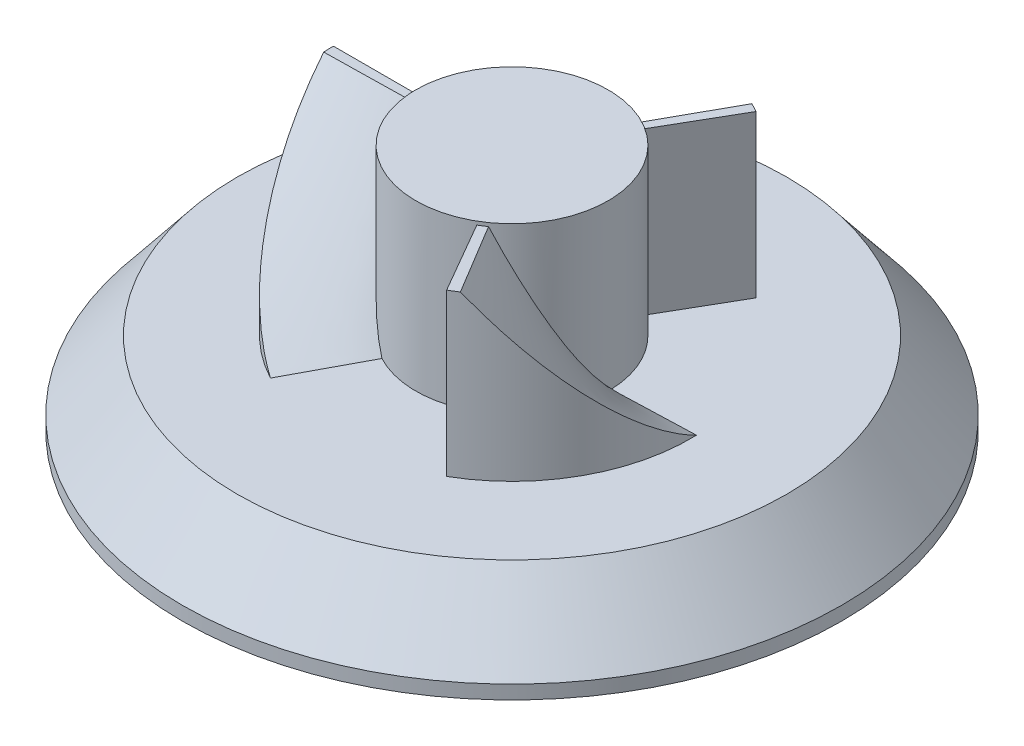
ISO-10303-21;
HEADER;
FILE_DESCRIPTION(('STEP AP214'),'2;1');
FILE_NAME('part.step','',(''),(''),'','','');
FILE_SCHEMA(('AUTOMOTIVE_DESIGN { 1 0 10303 214 1 1 1 1 }'));
ENDSEC;
DATA;
#1=APPLICATION_CONTEXT('core data for automotive mechanical design processes');
#2=APPLICATION_PROTOCOL_DEFINITION('international standard','automotive_design',2000,#1);
#3=PRODUCT_CONTEXT('',#1,'mechanical');
#4=PRODUCT('Part','Part','',(#3));
#5=PRODUCT_RELATED_PRODUCT_CATEGORY('part','',(#4));
#6=PRODUCT_DEFINITION_FORMATION('','',#4);
#7=PRODUCT_DEFINITION_CONTEXT('part definition',#1,'design');
#8=PRODUCT_DEFINITION('design','',#6,#7);
#9=PRODUCT_DEFINITION_SHAPE('','',#8);
#10=(LENGTH_UNIT() NAMED_UNIT(*) SI_UNIT(.MILLI.,.METRE.));
#11=(NAMED_UNIT(*) PLANE_ANGLE_UNIT() SI_UNIT($,.RADIAN.));
#12=(NAMED_UNIT(*) SI_UNIT($,.STERADIAN.) SOLID_ANGLE_UNIT());
#13=UNCERTAINTY_MEASURE_WITH_UNIT(LENGTH_MEASURE(1.E-05),#10,'distance_accuracy_value','');
#14=(GEOMETRIC_REPRESENTATION_CONTEXT(3) GLOBAL_UNCERTAINTY_ASSIGNED_CONTEXT((#13)) GLOBAL_UNIT_ASSIGNED_CONTEXT((#10,
#11,#12)) REPRESENTATION_CONTEXT('',''));
#15=CARTESIAN_POINT('',(0.,0.,0.));
#16=DIRECTION('',(0.,0.,1.));
#17=DIRECTION('',(1.,0.,0.));
#18=AXIS2_PLACEMENT_3D('',#15,#16,#17);
#19=CARTESIAN_POINT('',(0.,14.0890625,0.));
#20=DIRECTION('',(0.,1.,0.));
#21=DIRECTION('',(0.866025403784443,0.,-0.499999999999992));
#22=AXIS2_PLACEMENT_3D('',#19,#20,#21);
#23=PLANE('',#22);
#24=CARTESIAN_POINT('',(0.,14.0890625,0.));
#25=DIRECTION('',(0.,1.,0.));
#26=DIRECTION('',(0.866025403784443,0.,-0.499999999999992));
#27=AXIS2_PLACEMENT_3D('',#24,#25,#26);
#28=CIRCLE('',#27,5.55625);
#29=CARTESIAN_POINT('',(2.77812499999995,14.0890625,4.81185364977731));
#30=VERTEX_POINT('',#29);
#31=CARTESIAN_POINT('',(3.19237647885135,14.0890625,4.54759788017549));
#32=VERTEX_POINT('',#31);
#33=EDGE_CURVE('E227',#30,#32,#28,.T.);
#34=ORIENTED_EDGE('',*,*,#33,.F.);
#35=DIRECTION('',(0.499999999999992,0.,0.866025403784443));
#36=VECTOR('',#35,1.);
#37=CARTESIAN_POINT('',(2.77812499999995,14.0890625,4.81185364977731));
#38=LINE('',#37,#36);
#39=CARTESIAN_POINT('',(5.15854949999992,14.0890625,8.93486982735908));
#40=VERTEX_POINT('',#39);
#41=EDGE_CURVE('E278',#30,#40,#38,.T.);
#42=ORIENTED_EDGE('',*,*,#41,.T.);
#43=CARTESIAN_POINT('',(-2.34994393743815E-13,14.0890625,-1.27278935977364E-13));
#44=DIRECTION('',(0.,1.,0.));
#45=DIRECTION('',(0.866025403784443,0.,-0.499999999999992));
#46=AXIS2_PLACEMENT_3D('',#43,#44,#45);
#47=CIRCLE('',#46,10.3170990000002);
#48=CARTESIAN_POINT('',(5.65134444194319,14.0890625,8.63161849100843));
#49=VERTEX_POINT('',#48);
#50=EDGE_CURVE('E658',#40,#49,#47,.T.);
#51=ORIENTED_EDGE('',*,*,#50,.T.);
#52=CARTESIAN_POINT('',(3.19236971065958,14.0890625032246,4.54760566581315));
#53=CARTESIAN_POINT('',(3.4105975646822,14.0890625013261,4.91011699002403));
#54=CARTESIAN_POINT('',(3.62883286887451,14.0890625003943,5.27262382929751));
#55=CARTESIAN_POINT('',(4.06531842637323,14.0890624996057,5.99762850780289));
#56=CARTESIAN_POINT('',(4.28356867967964,14.0890624997488,6.36012634703478));
#57=CARTESIAN_POINT('',(4.88497393711525,14.089062500441,7.35897009332785));
#58=CARTESIAN_POINT('',(5.26814455191824,14.0890625012152,7.99530660122229));
#59=CARTESIAN_POINT('',(5.6513384082714,14.0890625,8.63162911324434));
#60=B_SPLINE_CURVE_WITH_KNOTS('',3,(#52,#53,#54,#55,#56,#57,#58,#59),.UNSPECIFIED.,.F.,.F.,(4,2,
2,4),(0.,1.26938595697646,2.53877191395458,4.76715582022197),.UNSPECIFIED.);
#61=EDGE_CURVE('E645',#32,#49,#60,.T.);
#62=ORIENTED_EDGE('',*,*,#61,.F.);
#63=EDGE_LOOP('',(#34,#42,#51,#62));
#64=FACE_BOUND('',#63,.T.);
#65=ADVANCED_FACE('F253',(#64),#23,.T.);
#66=CARTESIAN_POINT('',(2.77812499999995,20.0245471377706,4.81185364977731));
#67=DIRECTION('',(0.866025403784443,0.,-0.499999999999992));
#68=DIRECTION('',(0.,-1.,0.));
#69=AXIS2_PLACEMENT_3D('',#66,#67,#68);
#70=PLANE('',#69);
#71=ORIENTED_EDGE('',*,*,#41,.F.);
#72=DIRECTION('',(0.,-1.,0.));
#73=VECTOR('',#72,1.);
#74=CARTESIAN_POINT('',(2.77812499999995,20.0245471377706,4.81185364977731));
#75=LINE('',#74,#73);
#76=CARTESIAN_POINT('',(2.77812499999995,4.7625,4.81185364977731));
#77=VERTEX_POINT('',#76);
#78=EDGE_CURVE('E673',#30,#77,#75,.T.);
#79=ORIENTED_EDGE('',*,*,#78,.T.);
#80=DIRECTION('',(0.499999999999992,0.,0.866025403784443));
#81=VECTOR('',#80,1.);
#82=CARTESIAN_POINT('',(2.77812499999995,4.7625,4.81185364977731));
#83=LINE('',#82,#81);
#84=CARTESIAN_POINT('',(5.15854949999992,4.7625,8.93486982735908));
#85=VERTEX_POINT('',#84);
#86=EDGE_CURVE('E263',#77,#85,#83,.T.);
#87=ORIENTED_EDGE('',*,*,#86,.T.);
#88=DIRECTION('',(0.,-1.,0.));
#89=VECTOR('',#88,1.);
#90=CARTESIAN_POINT('',(5.15854949999992,20.0245471377706,8.93486982735908));
#91=LINE('',#90,#89);
#92=EDGE_CURVE('E662',#40,#85,#91,.T.);
#93=ORIENTED_EDGE('',*,*,#92,.F.);
#94=EDGE_LOOP('',(#71,#79,#87,#93));
#95=FACE_BOUND('',#94,.T.);
#96=ADVANCED_FACE('F680',(#95),#70,.F.);
#97=CARTESIAN_POINT('',(-2.34994393743815E-13,20.0245471377706,-1.27088173132668E-13));
#98=DIRECTION('',(0.,-1.,0.));
#99=DIRECTION('',(-0.866025403784443,0.,0.499999999999992));
#100=AXIS2_PLACEMENT_3D('',#97,#98,#99);
#101=CYLINDRICAL_SURFACE('',#100,10.3170990000002);
#102=ORIENTED_EDGE('',*,*,#50,.F.);
#103=ORIENTED_EDGE('',*,*,#92,.T.);
#104=CARTESIAN_POINT('',(-2.34994393743815E-13,4.7625,-1.27578685989757E-13));
#105=DIRECTION('',(0.,1.,0.));
#106=DIRECTION('',(0.866025403784443,0.,-0.499999999999992));
#107=AXIS2_PLACEMENT_3D('',#104,#105,#106);
#108=CIRCLE('',#107,10.3170990000002);
#109=CARTESIAN_POINT('',(10.3112463050324,4.7625,-0.347464261120108));
#110=VERTEX_POINT('',#109);
#111=EDGE_CURVE('E666',#85,#110,#108,.T.);
#112=ORIENTED_EDGE('',*,*,#111,.T.);
#113=CARTESIAN_POINT('',(9.83170040013376,7.11756354775058,3.12733097349962));
#114=CARTESIAN_POINT('',(9.87538355132948,7.00103311729126,2.98998937129289));
#115=CARTESIAN_POINT('',(9.91652989565909,6.88583607115862,2.850689371109));
#116=CARTESIAN_POINT('',(9.99290161094393,6.65997794130164,2.57012017939754));
#117=CARTESIAN_POINT('',(10.0281995503523,6.54927657704112,2.42890311944083));
#118=CARTESIAN_POINT('',(10.0927841735259,6.33258975089081,2.14467117336124));
#119=CARTESIAN_POINT('',(10.1221459529281,6.22656067156618,2.00170671358596));
#120=CARTESIAN_POINT('',(10.1747616512615,6.01940752613842,1.71415722551683));
#121=CARTESIAN_POINT('',(10.1980927343348,5.91823654341795,1.56962019124599));
#122=CARTESIAN_POINT('',(10.2385526859972,5.72098594937692,1.27910177444507));
#123=CARTESIAN_POINT('',(10.2557600213007,5.62485647413353,1.13316526779103));
#124=CARTESIAN_POINT('',(10.2838784672141,5.437876056161,0.840026291693822));
#125=CARTESIAN_POINT('',(10.294868383655,5.34697280356044,0.692864824551129));
#126=CARTESIAN_POINT('',(10.3104587606913,5.17062932645605,0.397450889411813));
#127=CARTESIAN_POINT('',(10.3151371464827,5.08513513567946,0.249234876951194));
#128=CARTESIAN_POINT('',(10.3180135099169,4.91980056761641,-0.0480976014691051));
#129=CARTESIAN_POINT('',(10.3162870243019,4.83990553990756,-0.197182997972606));
#130=CARTESIAN_POINT('',(10.3112463050324,4.7625,-0.347464261120093));
#131=B_SPLINE_CURVE_WITH_KNOTS('',3,(#113,#114,#115,#116,#117,#118,#119,#120,#121,#122,#123,
#124,#125,#126,#127,#128,#129,#130),.UNSPECIFIED.,.F.,.F.,(4,2,2,2,2,2,2,2,4),(0.,
0.556004175834258,1.10448677511103,1.64552398709619,2.179251169221,2.70586980590569,
3.22565473923862,3.73896155624869,4.24623396783489),.UNSPECIFIED.);
#132=CARTESIAN_POINT('',(9.83170040013376,7.11756354775058,3.12733097349962));
#133=VERTEX_POINT('',#132);
#134=EDGE_CURVE('E619',#133,#110,#131,.T.);
#135=ORIENTED_EDGE('',*,*,#134,.F.);
#136=CARTESIAN_POINT('',(5.49854274300475,14.2875,8.72975139847355));
#137=CARTESIAN_POINT('',(8.60195770803907,10.2779686259833,6.77502679571962));
#138=CARTESIAN_POINT('',(10.4347693858802,6.65058310214233,3.31817003137396));
#139=CARTESIAN_POINT('',(10.3112463050324,4.7625,-0.347464261120093));
#140=B_SPLINE_CURVE_WITH_KNOTS('',3,(#136,#137,#138,#139),.UNSPECIFIED.,.F.,.F.,(4,4),(0.,1.),.UNSPECIFIED.);
#141=CARTESIAN_POINT('',(8.10558590323824,10.5337807261086,6.38294672866896));
#142=VERTEX_POINT('',#141);
#143=EDGE_CURVE('E630',#142,#133,#140,.T.);
#144=ORIENTED_EDGE('',*,*,#143,.F.);
#145=CARTESIAN_POINT('',(5.65134165445893,14.0890571197496,8.63162496247652));
#146=CARTESIAN_POINT('',(5.76766440054171,13.937192485245,8.55547145583613));
#147=CARTESIAN_POINT('',(5.88252291926056,13.7854055608572,8.47692464235881));
#148=CARTESIAN_POINT('',(6.10841127546717,13.4831607541603,8.31563141745894));
#149=CARTESIAN_POINT('',(6.21946222314373,13.3327009838614,8.23291810311871));
#150=CARTESIAN_POINT('',(6.43766080562355,13.0332602154464,8.06343699137192));
#151=CARTESIAN_POINT('',(6.5448310155968,12.8842764399458,7.97670319692709));
#152=CARTESIAN_POINT('',(6.73254760596127,12.6198264550236,7.81840302452953));
#153=CARTESIAN_POINT('',(6.81372257207801,12.5042620613102,7.7477442107826));
#154=CARTESIAN_POINT('',(6.96817560980569,12.2820240192265,7.60899708759228));
#155=CARTESIAN_POINT('',(7.04159367863583,12.1753250047131,7.54110521801016));
#156=CARTESIAN_POINT('',(7.20464239728649,11.9359261981967,7.38586500474082));
#157=CARTESIAN_POINT('',(7.29379064182533,11.8033241361146,7.29785837092724));
#158=CARTESIAN_POINT('',(7.49559231261047,11.4990951757743,7.09120958155127));
#159=CARTESIAN_POINT('',(7.60727831649618,11.3276891110837,6.97129413961867));
#160=CARTESIAN_POINT('',(7.84997635978209,10.9481709879264,6.69782371989578));
#161=CARTESIAN_POINT('',(7.97975519622295,10.7403828468296,6.54272316624375));
#162=CARTESIAN_POINT('',(8.10558590323824,10.5337807261086,6.38294672866896));
#163=B_SPLINE_CURVE_WITH_KNOTS('',3,(#145,#146,#147,#148,#149,#150,#151,#152,#153,#154,#155,
#156,#157,#158,#159,#160,#161,#162),.UNSPECIFIED.,.F.,.F.,(4,2,2,2,2,2,2,2,4),(0.,
0.617669745154775,1.23103316446487,1.83991932888812,2.31362905191251,2.75230050628312,
3.29949307798517,4.01076372458203,4.88038783259177),.UNSPECIFIED.);
#164=EDGE_CURVE('E640',#49,#142,#163,.T.);
#165=ORIENTED_EDGE('',*,*,#164,.F.);
#166=EDGE_LOOP('',(#102,#103,#112,#135,#144,#165));
#167=FACE_BOUND('',#166,.T.);
#168=ADVANCED_FACE('F581',(#167),#101,.T.);
#169=CARTESIAN_POINT('',(5.49854274300475,14.2875,8.72975139847355));
#170=CARTESIAN_POINT('',(4.70397454632911,14.2875,7.35351891175294));
#171=CARTESIAN_POINT('',(3.90940634965347,14.2875,5.97728642503232));
#172=CARTESIAN_POINT('',(3.11483815297783,14.2875,4.6010539383117));
#173=CARTESIAN_POINT('',(8.60195770803907,10.2779686259833,6.77502679571962));
#174=CARTESIAN_POINT('',(7.30011400280976,10.2720560523493,5.69346602067495));
#175=CARTESIAN_POINT('',(5.99827029758046,10.2661434787153,4.61190524563029));
#176=CARTESIAN_POINT('',(4.69642659235116,10.2602309050812,3.53034447058563));
#177=CARTESIAN_POINT('',(10.4347693858802,6.65058310214233,3.31817003137396));
#178=CARTESIAN_POINT('',(8.82898681217134,6.65451779289956,2.78602088248543));
#179=CARTESIAN_POINT('',(7.22320423846246,6.65845248365679,2.25387173359689));
#180=CARTESIAN_POINT('',(5.61742166475357,6.66238717441402,1.72172258470836));
#181=CARTESIAN_POINT('',(10.3112463050324,4.7625,-0.347464261120093));
#182=CARTESIAN_POINT('',(8.72519688487188,4.7625,-0.294018201005413));
#183=CARTESIAN_POINT('',(7.13914746471132,4.7625,-0.240572140890735));
#184=CARTESIAN_POINT('',(5.55309804455075,4.7625,-0.187126080776057));
#185=B_SPLINE_SURFACE_WITH_KNOTS('',3,3,((#169,#170,#171,#172),(#173,#174,#175,#176),(#177,#178,
#179,#180),(#181,#182,#183,#184)),.UNSPECIFIED.,.F.,.F.,.F.,(4,4),(4,4),(0.,1.),(0.,1.),.UNSPECIFIED.);
#186=CARTESIAN_POINT('',(5.55309804455075,4.7625,-0.187126080776057));
#187=CARTESIAN_POINT('',(5.61742166475357,6.66238717441402,1.72172258470836));
#188=CARTESIAN_POINT('',(4.69642659235116,10.2602309050812,3.53034447058563));
#189=CARTESIAN_POINT('',(3.11483815297783,14.2875,4.6010539383117));
#190=B_SPLINE_CURVE_WITH_KNOTS('',3,(#186,#187,#188,#189),.UNSPECIFIED.,.F.,.F.,(4,4),(0.,1.),.UNSPECIFIED.);
#191=CARTESIAN_POINT('',(5.55309804455075,4.7625,-0.187126080776057));
#192=VERTEX_POINT('',#191);
#193=EDGE_CURVE('E431',#192,#32,#190,.T.);
#194=DIRECTION('',(-0.999432718929269,0.,0.033678484729097));
#195=VECTOR('',#194,1.);
#196=CARTESIAN_POINT('',(7.9321721747916,4.7625,-0.267295170948074));
#197=LINE('',#196,#195);
#198=EDGE_CURVE('E656',#110,#192,#197,.T.);
#199=ORIENTED_EDGE('',*,*,#193,.T.);
#200=ORIENTED_EDGE('',*,*,#61,.T.);
#201=ORIENTED_EDGE('',*,*,#164,.T.);
#202=ORIENTED_EDGE('',*,*,#143,.T.);
#203=ORIENTED_EDGE('',*,*,#134,.T.);
#204=ORIENTED_EDGE('',*,*,#198,.T.);
#205=EDGE_LOOP('',(#199,#200,#201,#202,#203,#204));
#206=FACE_BOUND('',#205,.T.);
#207=ADVANCED_FACE('F574',(#206),#185,.T.);
#208=CARTESIAN_POINT('',(0.,14.0890625,0.));
#209=DIRECTION('',(0.,1.,0.));
#210=DIRECTION('',(-0.866025403784436,0.,-0.500000000000004));
#211=AXIS2_PLACEMENT_3D('',#208,#209,#210);
#212=PLANE('',#211);
#213=CARTESIAN_POINT('',(0.,14.0890625,0.));
#214=DIRECTION('',(0.,1.,0.));
#215=DIRECTION('',(-0.866025403784436,0.,-0.500000000000004));
#216=AXIS2_PLACEMENT_3D('',#213,#214,#215);
#217=CIRCLE('',#216,5.55625);
#218=CARTESIAN_POINT('',(2.77812500000002,14.0890625,-4.81185364977727));
#219=VERTEX_POINT('',#218);
#220=CARTESIAN_POINT('',(2.34214705100254,14.0890625,-5.03847806921694));
#221=VERTEX_POINT('',#220);
#222=EDGE_CURVE('E689',#219,#221,#217,.T.);
#223=ORIENTED_EDGE('',*,*,#222,.F.);
#224=DIRECTION('',(0.500000000000004,0.,-0.866025403784436));
#225=VECTOR('',#224,1.);
#226=CARTESIAN_POINT('',(2.77812500000002,14.0890625,-4.81185364977727));
#227=LINE('',#226,#225);
#228=CARTESIAN_POINT('',(5.15854950000004,14.0890625,-8.93486982735901));
#229=VERTEX_POINT('',#228);
#230=EDGE_CURVE('E702',#219,#229,#227,.T.);
#231=ORIENTED_EDGE('',*,*,#230,.T.);
#232=CARTESIAN_POINT('',(0.,14.0890625,2.67829803490512E-13));
#233=DIRECTION('',(0.,1.,0.));
#234=DIRECTION('',(-0.866025403784436,0.,-0.500000000000004));
#235=AXIS2_PLACEMENT_3D('',#232,#233,#234);
#236=CIRCLE('',#235,10.3170990000002);
#237=CARTESIAN_POINT('',(4.64952866801717,14.0890625,-9.21001709776303));
#238=VERTEX_POINT('',#237);
#239=EDGE_CURVE('E713',#229,#238,#236,.T.);
#240=ORIENTED_EDGE('',*,*,#239,.T.);
#241=CARTESIAN_POINT('',(2.34215717765841,14.0890625032246,-5.03847610060976));
#242=CARTESIAN_POINT('',(2.54698726657326,14.0890625013261,-5.40872262811215));
#243=CARTESIAN_POINT('',(2.75180974633355,14.0890625003943,-5.77897336518206));
#244=CARTESIAN_POINT('',(3.16143943703241,14.0890624996057,-6.51948328561365));
#245=CARTESIAN_POINT('',(3.36624664797099,14.0890624997488,-6.88974246897534));
#246=CARTESIAN_POINT('',(3.9305680779542,14.089062500441,-7.90999657303064));
#247=CARTESIAN_POINT('',(4.29006635174476,14.0890625012152,-8.56000031338095));
#248=CARTESIAN_POINT('',(4.64954088397921,14.0890625,-9.21001718356794));
#249=B_SPLINE_CURVE_WITH_KNOTS('',3,(#241,#242,#243,#244,#245,#246,#247,#248),.UNSPECIFIED.,.F.,
.F.,(4,2,2,4),(0.,1.26938595697646,2.53877191395458,4.76715582022197),.UNSPECIFIED.);
#250=EDGE_CURVE('E555',#221,#238,#249,.T.);
#251=ORIENTED_EDGE('',*,*,#250,.F.);
#252=EDGE_LOOP('',(#223,#231,#240,#251));
#253=FACE_BOUND('',#252,.T.);
#254=ADVANCED_FACE('F569',(#253),#212,.T.);
#255=CARTESIAN_POINT('',(2.77812500000002,20.0245471377706,-4.81185364977727));
#256=DIRECTION('',(-0.866025403784436,0.,-0.500000000000004));
#257=DIRECTION('',(0.,-1.,0.));
#258=AXIS2_PLACEMENT_3D('',#255,#256,#257);
#259=PLANE('',#258);
#260=ORIENTED_EDGE('',*,*,#230,.F.);
#261=DIRECTION('',(0.,-1.,0.));
#262=VECTOR('',#261,1.);
#263=CARTESIAN_POINT('',(2.77812500000002,20.0245471377706,-4.81185364977727));
#264=LINE('',#263,#262);
#265=CARTESIAN_POINT('',(2.77812500000002,4.7625,-4.81185364977727));
#266=VERTEX_POINT('',#265);
#267=EDGE_CURVE('E696',#219,#266,#264,.T.);
#268=ORIENTED_EDGE('',*,*,#267,.T.);
#269=DIRECTION('',(0.500000000000004,0.,-0.866025403784436));
#270=VECTOR('',#269,1.);
#271=CARTESIAN_POINT('',(2.77812500000002,4.7625,-4.81185364977727));
#272=LINE('',#271,#270);
#273=CARTESIAN_POINT('',(5.15854950000004,4.7625,-8.93486982735901));
#274=VERTEX_POINT('',#273);
#275=EDGE_CURVE('E693',#266,#274,#272,.T.);
#276=ORIENTED_EDGE('',*,*,#275,.T.);
#277=DIRECTION('',(0.,-1.,0.));
#278=VECTOR('',#277,1.);
#279=CARTESIAN_POINT('',(5.15854950000004,20.0245471377706,-8.93486982735901));
#280=LINE('',#279,#278);
#281=EDGE_CURVE('E709',#229,#274,#280,.T.);
#282=ORIENTED_EDGE('',*,*,#281,.F.);
#283=EDGE_LOOP('',(#260,#268,#276,#282));
#284=FACE_BOUND('',#283,.T.);
#285=ADVANCED_FACE('F573',(#284),#259,.F.);
#286=CARTESIAN_POINT('',(0.,20.0245471377706,2.68020566335207E-13));
#287=DIRECTION('',(0.,-1.,0.));
#288=DIRECTION('',(0.866025403784436,0.,0.500000000000004));
#289=AXIS2_PLACEMENT_3D('',#286,#287,#288);
#290=CYLINDRICAL_SURFACE('',#289,10.3170990000002);
#291=ORIENTED_EDGE('',*,*,#239,.F.);
#292=ORIENTED_EDGE('',*,*,#281,.T.);
#293=CARTESIAN_POINT('',(0.,4.7625,2.67530053478119E-13));
#294=DIRECTION('',(0.,1.,0.));
#295=DIRECTION('',(-0.866025403784436,0.,-0.500000000000004));
#296=AXIS2_PLACEMENT_3D('',#293,#294,#295);
#297=CIRCLE('',#296,10.3170990000002);
#298=CARTESIAN_POINT('',(-5.45653602955347,4.7625,-8.75606911427645));
#299=VERTEX_POINT('',#298);
#300=EDGE_CURVE('E705',#274,#299,#297,.T.);
#301=ORIENTED_EDGE('',*,*,#300,.T.);
#302=CARTESIAN_POINT('',(-2.20750213097433,7.11756354775058,-10.0781677956633));
#303=CARTESIAN_POINT('',(-2.34828502307969,7.00103311729126,-10.0473277132128));
#304=CARTESIAN_POINT('',(-2.48949553415092,6.88583607115863,-10.0133114925831));
#305=CARTESIAN_POINT('',(-2.77066143933473,6.65997794130165,-9.93916674229464));
#306=CARTESIAN_POINT('',(-2.91060797040919,6.54927657704112,-9.89912712454522));
#307=CARTESIAN_POINT('',(-3.18905236786799,6.33258975089081,-9.81294307586759));
#308=CARTESIAN_POINT('',(-3.32754411157278,6.22656067156618,-9.76688889284251));
#309=CARTESIAN_POINT('',(-3.60287712225258,6.01940752613842,-9.66868068020258));
#310=CARTESIAN_POINT('',(-3.73971540725542,5.91823654341795,-9.6166174737064));
#311=CARTESIAN_POINT('',(-4.01154171230345,5.72098594937692,-9.50639761128146));
#312=CARTESIAN_POINT('',(-4.14653010205715,5.62485647413353,-9.44833134745871));
#313=CARTESIAN_POINT('',(-4.41445512515342,5.437876056161,-9.3261131478861));
#314=CARTESIAN_POINT('',(-4.54739565237764,5.34697280356044,-9.26204996113805));
#315=CARTESIAN_POINT('',(-4.81102681335832,5.17062932645605,-9.12784465613633));
#316=CARTESIAN_POINT('',(-4.94172483829259,5.08513513567946,-9.05778825085014));
#317=CARTESIAN_POINT('',(-5.20066049969182,4.91980056761641,-8.91161301544447));
#318=CARTESIAN_POINT('',(-5.32890899758966,4.83990553990756,-8.83557513679092));
#319=CARTESIAN_POINT('',(-5.45653602955345,4.7625,-8.75606911427646));
#320=B_SPLINE_CURVE_WITH_KNOTS('',3,(#302,#303,#304,#305,#306,#307,#308,#309,#310,#311,#312,
#313,#314,#315,#316,#317,#318,#319),.UNSPECIFIED.,.F.,.F.,(4,2,2,2,2,2,2,2,4),(0.,
0.55600417583426,1.10448677511103,1.64552398709619,2.179251169221,2.70586980590569,
3.22565473923863,3.73896155624869,4.24623396783489),.UNSPECIFIED.);
#321=CARTESIAN_POINT('',(-2.20750213097433,7.11756354775058,-10.0781677956633));
#322=VERTEX_POINT('',#321);
#323=EDGE_CURVE('E529',#322,#299,#320,.T.);
#324=ORIENTED_EDGE('',*,*,#323,.F.);
#325=CARTESIAN_POINT('',(4.81091510829841,14.2875,-9.12675339847348));
#326=CARTESIAN_POINT('',(1.56636646239389,10.2779686259833,-10.837027295301));
#327=CARTESIAN_POINT('',(-2.34376515169411,6.65058310214233,-10.6958603864914));
#328=CARTESIAN_POINT('',(-5.45653602955345,4.7625,-8.75606911427646));
#329=B_SPLINE_CURVE_WITH_KNOTS('',3,(#325,#326,#327,#328),.UNSPECIFIED.,.F.,.F.,(4,4),(0.,1.),.UNSPECIFIED.);
#330=CARTESIAN_POINT('',(1.47500106641093,10.5337807261086,-10.2111166690958));
#331=VERTEX_POINT('',#330);
#332=EDGE_CURVE('E540',#331,#322,#329,.T.);
#333=ORIENTED_EDGE('',*,*,#332,.F.);
#334=CARTESIAN_POINT('',(4.64953566621506,14.0890571197496,-9.2100179194649));
#335=CARTESIAN_POINT('',(4.52542342183583,13.937192485245,-9.27267961929036));
#336=CARTESIAN_POINT('',(4.39997062661873,13.7854055608572,-9.33287660760327));
#337=CARTESIAN_POINT('',(4.14734241829382,13.4831607541603,-9.44785505004737));
#338=CARTESIAN_POINT('',(4.02018511300569,13.3327009838614,-9.50267133467949));
#339=CARTESIAN_POINT('',(3.76431087353142,13.0332602154464,-9.60689629430337));
#340=CARTESIAN_POINT('',(3.63561209918896,12.8842764399458,-9.65634152144669));
#341=CARTESIAN_POINT('',(3.40466183328698,12.6198264550236,-9.73975877121534));
#342=CARTESIAN_POINT('',(3.3028820225225,12.5042620613102,-9.77472894715032));
#343=CARTESIAN_POINT('',(3.10549697027384,12.2820240192265,-9.839115639919));
#344=CARTESIAN_POINT('',(3.00999185209023,12.1753250047131,-9.86875161783165));
#345=CARTESIAN_POINT('',(2.79402552438474,11.9359261981967,-9.93233584360295));
#346=CARTESIAN_POINT('',(2.6732354215312,11.8033241361146,-9.96553717116957));
#347=CARTESIAN_POINT('',(2.39337148487774,11.4990951757743,-10.0369781499077));
#348=CARTESIAN_POINT('',(2.23367866391522,11.3276891110837,-10.0737433455536));
#349=CARTESIAN_POINT('',(1.87549731160864,10.9481709879264,-10.1471908066265));
#350=CARTESIAN_POINT('',(1.67628687378452,10.7403828468296,-10.1820322990318));
#351=CARTESIAN_POINT('',(1.47500106641093,10.5337807261086,-10.2111166690958));
#352=B_SPLINE_CURVE_WITH_KNOTS('',3,(#334,#335,#336,#337,#338,#339,#340,#341,#342,#343,#344,
#345,#346,#347,#348,#349,#350,#351),.UNSPECIFIED.,.F.,.F.,(4,2,2,2,2,2,2,2,4),(0.,
0.617669745154776,1.23103316446487,1.83991932888813,2.31362905191251,2.75230050628312,
3.29949307798517,4.01076372458203,4.88038783259177),.UNSPECIFIED.);
#353=EDGE_CURVE('E550',#238,#331,#352,.T.);
#354=ORIENTED_EDGE('',*,*,#353,.F.);
#355=EDGE_LOOP('',(#291,#292,#301,#324,#333,#354));
#356=FACE_BOUND('',#355,.T.);
#357=ADVANCED_FACE('F493',(#356),#290,.T.);
#358=CARTESIAN_POINT('',(4.81091510829841,14.2875,-9.12675339847348));
#359=CARTESIAN_POINT('',(4.01634691162275,14.2875,-7.75052091175287));
#360=CARTESIAN_POINT('',(3.2217787149471,14.2875,-6.37428842503227));
#361=CARTESIAN_POINT('',(2.42721051827144,14.2875,-4.99805593831166));
#362=CARTESIAN_POINT('',(1.56636646239389,10.2779686259833,-10.837027295301));
#363=CARTESIAN_POINT('',(1.28062920808308,10.2720560523493,-9.16881718729325));
#364=CARTESIAN_POINT('',(0.994891953772277,10.2661434787153,-7.50060707928547));
#365=CARTESIAN_POINT('',(0.709154699461471,10.2602309050812,-5.8323969712777));
#366=CARTESIAN_POINT('',(-2.34376515169411,6.65058310214233,-10.6958603864914));
#367=CARTESIAN_POINT('',(-2.00172854637939,6.65451779289956,-9.03913731026088));
#368=CARTESIAN_POINT('',(-1.65969194106468,6.65845248365679,-7.38241423403036));
#369=CARTESIAN_POINT('',(-1.31765533574997,6.66238717441402,-5.72569115779984));
#370=CARTESIAN_POINT('',(-5.45653602955345,4.7625,-8.75606911427646));
#371=CARTESIAN_POINT('',(-4.61722567368166,4.7625,-7.40923305481717));
#372=CARTESIAN_POINT('',(-3.77791531780987,4.7625,-6.06239699535788));
#373=CARTESIAN_POINT('',(-2.93860496193808,4.7625,-4.7155609358986));
#374=B_SPLINE_SURFACE_WITH_KNOTS('',3,3,((#358,#359,#360,#361),(#362,#363,#364,#365),(#366,#367,
#368,#369),(#370,#371,#372,#373)),.UNSPECIFIED.,.F.,.F.,.F.,(4,4),(4,4),(0.,1.),(0.,1.),.UNSPECIFIED.);
#375=CARTESIAN_POINT('',(-2.93860496193808,4.7625,-4.7155609358986));
#376=CARTESIAN_POINT('',(-1.31765533574997,6.66238717441402,-5.72569115779984));
#377=CARTESIAN_POINT('',(0.709154699461471,10.2602309050812,-5.8323969712777));
#378=CARTESIAN_POINT('',(2.42721051827144,14.2875,-4.99805593831166));
#379=B_SPLINE_CURVE_WITH_KNOTS('',3,(#375,#376,#377,#378),.UNSPECIFIED.,.F.,.F.,(4,4),(0.,1.),.UNSPECIFIED.);
#380=CARTESIAN_POINT('',(-2.93860496193808,4.7625,-4.7155609358986));
#381=VERTEX_POINT('',#380);
#382=EDGE_CURVE('E426',#381,#221,#379,.T.);
#383=DIRECTION('',(0.528882782801003,0.,0.848694881601549));
#384=VECTOR('',#383,1.);
#385=CARTESIAN_POINT('',(-4.19757049574577,4.7625,-6.73581502508753));
#386=LINE('',#385,#384);
#387=EDGE_CURVE('E567',#299,#381,#386,.T.);
#388=ORIENTED_EDGE('',*,*,#382,.T.);
#389=ORIENTED_EDGE('',*,*,#250,.T.);
#390=ORIENTED_EDGE('',*,*,#353,.T.);
#391=ORIENTED_EDGE('',*,*,#332,.T.);
#392=ORIENTED_EDGE('',*,*,#323,.T.);
#393=ORIENTED_EDGE('',*,*,#387,.T.);
#394=EDGE_LOOP('',(#388,#389,#390,#391,#392,#393));
#395=FACE_BOUND('',#394,.T.);
#396=ADVANCED_FACE('F480',(#395),#374,.T.);
#397=CARTESIAN_POINT('',(-10.3094578513032,14.2875,0.397001999999999));
#398=CARTESIAN_POINT('',(-8.72032145795189,14.2875,0.397002));
#399=CARTESIAN_POINT('',(-7.13118506460059,14.2875,0.397002));
#400=CARTESIAN_POINT('',(-5.54204867124929,14.2875,0.397002000000001));
#401=CARTESIAN_POINT('',(-10.168324170433,10.2779686259833,4.06200049958148));
#402=CARTESIAN_POINT('',(-8.58074321089286,10.2720560523493,3.47535116661836));
#403=CARTESIAN_POINT('',(-6.99316225135275,10.2661434787153,2.88870183365524));
#404=CARTESIAN_POINT('',(-5.40558129181263,10.2602309050812,2.30205250069212));
#405=CARTESIAN_POINT('',(-8.09100423418611,6.65058310214233,7.37769035511752));
#406=CARTESIAN_POINT('',(-6.82725826579193,6.65451779289956,6.25311642777552));
#407=CARTESIAN_POINT('',(-5.56351229739776,6.65845248365679,5.12854250043352));
#408=CARTESIAN_POINT('',(-4.29976632900359,6.66238717441402,4.00396857309153));
#409=CARTESIAN_POINT('',(-4.85471027547895,4.7625,9.10353337539662));
#410=CARTESIAN_POINT('',(-4.10797121119018,4.7625,7.70325125582264));
#411=CARTESIAN_POINT('',(-3.36123214690141,4.7625,6.30296913624867));
#412=CARTESIAN_POINT('',(-2.61449308261265,4.7625,4.90268701667469));
#413=B_SPLINE_SURFACE_WITH_KNOTS('',3,3,((#397,#398,#399,#400),(#401,#402,#403,#404),(#405,#406,
#407,#408),(#409,#410,#411,#412)),.UNSPECIFIED.,.F.,.F.,.F.,(4,4),(4,4),(0.,1.),(0.,1.),.UNSPECIFIED.);
#414=CARTESIAN_POINT('',(-2.61449308261265,4.7625,4.90268701667469));
#415=CARTESIAN_POINT('',(-4.29976632900359,6.66238717441402,4.00396857309153));
#416=CARTESIAN_POINT('',(-5.40558129181263,10.2602309050812,2.30205250069212));
#417=CARTESIAN_POINT('',(-5.54204867124929,14.2875,0.397002000000001));
#418=B_SPLINE_CURVE_WITH_KNOTS('',3,(#414,#415,#416,#417),.UNSPECIFIED.,.F.,.F.,(4,4),(0.,1.),.UNSPECIFIED.);
#419=CARTESIAN_POINT('',(-2.61449308261265,4.7625,4.90268701667469));
#420=VERTEX_POINT('',#419);
#421=CARTESIAN_POINT('',(-5.53452352985391,14.0890625,0.490880189041489));
#422=VERTEX_POINT('',#421);
#423=EDGE_CURVE('E1025',#420,#422,#418,.T.);
#424=CARTESIAN_POINT('',(-5.53452688831802,14.0890625032246,0.490870434796657));
#425=CARTESIAN_POINT('',(-5.95758483125548,14.0890625013261,0.498605638088168));
#426=CARTESIAN_POINT('',(-6.38064261520808,14.0890625003943,0.506349535884595));
#427=CARTESIAN_POINT('',(-7.22675786340567,14.0890624996057,0.521854777810819));
#428=CARTESIAN_POINT('',(-7.64981532765065,14.0890624997488,0.529616121940616));
#429=CARTESIAN_POINT('',(-8.81554201506948,14.089062500441,0.551026479702853));
#430=CARTESIAN_POINT('',(-9.55821090366303,14.0890625012152,0.564693712158729));
#431=CARTESIAN_POINT('',(-10.3008792922506,14.0890625,0.57838807032367));
#432=B_SPLINE_CURVE_WITH_KNOTS('',3,(#424,#425,#426,#427,#428,#429,#430,#431),.UNSPECIFIED.,.F.,
.F.,(4,2,2,4),(0.,1.26938595697646,2.53877191395458,4.76715582022197),.UNSPECIFIED.);
#433=CARTESIAN_POINT('',(-10.3008731099604,14.0890625,0.57839860675467));
#434=VERTEX_POINT('',#433);
#435=EDGE_CURVE('E376',#422,#434,#432,.T.);
#436=CARTESIAN_POINT('',(-10.300877320674,14.0890571197496,0.578392956988453));
#437=CARTESIAN_POINT('',(-10.2930878223776,13.937192485245,0.717208163454297));
#438=CARTESIAN_POINT('',(-10.2824935458793,13.7854055608572,0.855951965244529));
#439=CARTESIAN_POINT('',(-10.255753693761,13.4831607541603,1.13222363258849));
#440=CARTESIAN_POINT('',(-10.2396473361494,13.3327009838614,1.26975323156085));
#441=CARTESIAN_POINT('',(-10.201971679155,13.0332602154464,1.54345930293153));
#442=CARTESIAN_POINT('',(-10.1804431147858,12.8842764399458,1.67963832451969));
#443=CARTESIAN_POINT('',(-10.1372094392483,12.6198264550236,1.92135574668589));
#444=CARTESIAN_POINT('',(-10.1166045946005,12.5042620613102,2.0269847363678));
#445=CARTESIAN_POINT('',(-10.0736725800795,12.2820240192265,2.2301185523268));
#446=CARTESIAN_POINT('',(-10.0515855307261,12.1753250047131,2.32764639982156));
#447=CARTESIAN_POINT('',(-9.99866792167125,11.9359261981967,2.5464708388622));
#448=CARTESIAN_POINT('',(-9.96702606335654,11.8033241361146,2.66767880024241));
#449=CARTESIAN_POINT('',(-9.88896379748823,11.4990951757743,2.94576856835647));
#450=CARTESIAN_POINT('',(-9.84095698041142,11.3276891110837,3.10244920593497));
#451=CARTESIAN_POINT('',(-9.72547367139074,10.9481709879264,3.44936708673078));
#452=CARTESIAN_POINT('',(-9.65604207000749,10.7403828468296,3.63930913278818));
#453=CARTESIAN_POINT('',(-9.58058696964918,10.5337807261086,3.82816994042696));
#454=B_SPLINE_CURVE_WITH_KNOTS('',3,(#436,#437,#438,#439,#440,#441,#442,#443,#444,#445,#446,
#447,#448,#449,#450,#451,#452,#453),.UNSPECIFIED.,.F.,.F.,(4,2,2,2,2,2,2,2,4),(0.,
0.617669745154775,1.23103316446487,1.83991932888812,2.31362905191251,2.75230050628312,
3.29949307798517,4.01076372458203,4.88038783259177),.UNSPECIFIED.);
#455=CARTESIAN_POINT('',(-9.58058696964918,10.5337807261086,3.82816994042696));
#456=VERTEX_POINT('',#455);
#457=EDGE_CURVE('E779',#434,#456,#454,.T.);
#458=CARTESIAN_POINT('',(-10.3094578513032,14.2875,0.397001999999999));
#459=CARTESIAN_POINT('',(-10.168324170433,10.2779686259833,4.06200049958148));
#460=CARTESIAN_POINT('',(-8.09100423418611,6.65058310214233,7.37769035511752));
#461=CARTESIAN_POINT('',(-4.85471027547895,4.7625,9.10353337539662));
#462=B_SPLINE_CURVE_WITH_KNOTS('',3,(#458,#459,#460,#461),.UNSPECIFIED.,.F.,.F.,(4,4),(0.,1.),.UNSPECIFIED.);
#463=CARTESIAN_POINT('',(-7.6241982691594,7.11756354775058,6.95083682216372));
#464=VERTEX_POINT('',#463);
#465=EDGE_CURVE('E733',#456,#464,#462,.T.);
#466=CARTESIAN_POINT('',(-7.6241982691594,7.11756354775058,6.95083682216372));
#467=CARTESIAN_POINT('',(-7.52709852824978,7.00103311729125,7.05733834191994));
#468=CARTESIAN_POINT('',(-7.42703436150816,6.88583607115862,7.16262212147419));
#469=CARTESIAN_POINT('',(-7.22224017160918,6.65997794130164,7.36904656289718));
#470=CARTESIAN_POINT('',(-7.11759157994313,6.54927657704112,7.47022400510446));
#471=CARTESIAN_POINT('',(-6.90373180565791,6.33258975089081,7.66827190250642));
#472=CARTESIAN_POINT('',(-6.79460184135526,6.22656067156618,7.76518217925663));
#473=CARTESIAN_POINT('',(-6.57188452900891,6.01940752613842,7.95452345468583));
#474=CARTESIAN_POINT('',(-6.45837732707933,5.91823654341794,8.04699728246049));
#475=CARTESIAN_POINT('',(-6.22701097369369,5.72098594937692,8.22729583683647));
#476=CARTESIAN_POINT('',(-6.10922991924349,5.62485647413353,8.31516607966775));
#477=CARTESIAN_POINT('',(-5.86942334206067,5.437876056161,8.48608685619235));
#478=CARTESIAN_POINT('',(-5.74747273127736,5.34697280356044,8.56918513658699));
#479=CARTESIAN_POINT('',(-5.4994319473329,5.17062932645605,8.73039376672459));
#480=CARTESIAN_POINT('',(-5.37341230819011,5.08513513567946,8.80855337389902));
#481=CARTESIAN_POINT('',(-5.11735301022501,4.91980056761641,8.95971061691365));
#482=CARTESIAN_POINT('',(-4.98737802671223,4.83990553990756,9.0327581347636));
#483=CARTESIAN_POINT('',(-4.85471027547895,4.7625,9.10353337539662));
#484=B_SPLINE_CURVE_WITH_KNOTS('',3,(#466,#467,#468,#469,#470,#471,#472,#473,#474,#475,#476,
#477,#478,#479,#480,#481,#482,#483),.UNSPECIFIED.,.F.,.F.,(4,2,2,2,2,2,2,2,4),(0.,
0.556004175834258,1.10448677511103,1.64552398709619,2.179251169221,2.70586980590569,
3.22565473923862,3.73896155624869,4.24623396783489),.UNSPECIFIED.);
#485=CARTESIAN_POINT('',(-4.85471027547893,4.7625,9.10353337539662));
#486=VERTEX_POINT('',#485);
#487=EDGE_CURVE('E728',#464,#486,#484,.T.);
#488=DIRECTION('',(0.470549936128262,0.,-0.882373366330653));
#489=VECTOR('',#488,1.);
#490=CARTESIAN_POINT('',(-3.7346016790458,4.7625,7.00311019603565));
#491=LINE('',#490,#489);
#492=EDGE_CURVE('E723',#486,#420,#491,.T.);
#493=ORIENTED_EDGE('',*,*,#423,.T.);
#494=ORIENTED_EDGE('',*,*,#435,.T.);
#495=ORIENTED_EDGE('',*,*,#457,.T.);
#496=ORIENTED_EDGE('',*,*,#465,.T.);
#497=ORIENTED_EDGE('',*,*,#487,.T.);
#498=ORIENTED_EDGE('',*,*,#492,.T.);
#499=EDGE_LOOP('',(#493,#494,#495,#496,#497,#498));
#500=FACE_BOUND('',#499,.T.);
#501=ADVANCED_FACE('F492',(#500),#413,.T.);
#502=CARTESIAN_POINT('',(2.2811613709095E-13,20.0245471377706,-1.39001663122929E-13));
#503=DIRECTION('',(0.,-1.,0.));
#504=DIRECTION('',(0.,0.,-1.));
#505=AXIS2_PLACEMENT_3D('',#502,#503,#504);
#506=CYLINDRICAL_SURFACE('',#505,10.3170990000002);
#507=CARTESIAN_POINT('',(2.2811613709095E-13,14.0890625,-1.39192425967624E-13));
#508=DIRECTION('',(0.,1.,0.));
#509=DIRECTION('',(0.,0.,1.));
#510=AXIS2_PLACEMENT_3D('',#507,#508,#509);
#511=CIRCLE('',#510,10.3170990000002);
#512=CARTESIAN_POINT('',(-10.317099,14.0890625,0.));
#513=VERTEX_POINT('',#512);
#514=EDGE_CURVE('E379',#513,#434,#511,.T.);
#515=ORIENTED_EDGE('',*,*,#514,.F.);
#516=DIRECTION('',(0.,-1.,0.));
#517=VECTOR('',#516,1.);
#518=CARTESIAN_POINT('',(-10.317099,20.0245471377706,0.));
#519=LINE('',#518,#517);
#520=CARTESIAN_POINT('',(-10.317099,4.7625,0.));
#521=VERTEX_POINT('',#520);
#522=EDGE_CURVE('E389',#513,#521,#519,.T.);
#523=ORIENTED_EDGE('',*,*,#522,.T.);
#524=CARTESIAN_POINT('',(2.2811613709095E-13,4.7625,-1.39492175980017E-13));
#525=DIRECTION('',(0.,1.,0.));
#526=DIRECTION('',(0.,0.,1.));
#527=AXIS2_PLACEMENT_3D('',#524,#525,#526);
#528=CIRCLE('',#527,10.3170990000002);
#529=EDGE_CURVE('E397',#521,#486,#528,.T.);
#530=ORIENTED_EDGE('',*,*,#529,.T.);
#531=ORIENTED_EDGE('',*,*,#487,.F.);
#532=ORIENTED_EDGE('',*,*,#465,.F.);
#533=ORIENTED_EDGE('',*,*,#457,.F.);
#534=EDGE_LOOP('',(#515,#523,#530,#531,#532,#533));
#535=FACE_BOUND('',#534,.T.);
#536=ADVANCED_FACE('F726',(#535),#506,.T.);
#537=CARTESIAN_POINT('',(-5.55625,20.0245471377706,0.));
#538=DIRECTION('',(0.,0.,1.));
#539=DIRECTION('',(0.,-1.,0.));
#540=AXIS2_PLACEMENT_3D('',#537,#538,#539);
#541=PLANE('',#540);
#542=DIRECTION('',(-1.,0.,0.));
#543=VECTOR('',#542,1.);
#544=CARTESIAN_POINT('',(-5.55625,14.0890625,0.));
#545=LINE('',#544,#543);
#546=CARTESIAN_POINT('',(-5.55625,14.0890625,0.));
#547=VERTEX_POINT('',#546);
#548=EDGE_CURVE('E373',#547,#513,#545,.T.);
#549=ORIENTED_EDGE('',*,*,#548,.F.);
#550=DIRECTION('',(0.,-1.,0.));
#551=VECTOR('',#550,1.);
#552=CARTESIAN_POINT('',(-5.55625,20.0245471377706,0.));
#553=LINE('',#552,#551);
#554=CARTESIAN_POINT('',(-5.55625,4.7625,0.));
#555=VERTEX_POINT('',#554);
#556=EDGE_CURVE('E387',#547,#555,#553,.T.);
#557=ORIENTED_EDGE('',*,*,#556,.T.);
#558=DIRECTION('',(-1.,0.,0.));
#559=VECTOR('',#558,1.);
#560=CARTESIAN_POINT('',(-5.55625,4.7625,0.));
#561=LINE('',#560,#559);
#562=EDGE_CURVE('E396',#555,#521,#561,.T.);
#563=ORIENTED_EDGE('',*,*,#562,.T.);
#564=ORIENTED_EDGE('',*,*,#522,.F.);
#565=EDGE_LOOP('',(#549,#557,#563,#564));
#566=FACE_BOUND('',#565,.T.);
#567=ADVANCED_FACE('F385',(#566),#541,.F.);
#568=CARTESIAN_POINT('',(0.,0.79375,0.));
#569=DIRECTION('',(0.,-1.,0.));
#570=DIRECTION('',(0.,0.,-1.));
#571=AXIS2_PLACEMENT_3D('',#568,#569,#570);
#572=CYLINDRICAL_SURFACE('',#571,19.05);
#573=CARTESIAN_POINT('',(0.,0.79375,0.));
#574=DIRECTION('',(0.,1.,0.));
#575=DIRECTION('',(0.,0.,1.));
#576=AXIS2_PLACEMENT_3D('',#573,#574,#575);
#577=CIRCLE('',#576,19.05);
#578=CARTESIAN_POINT('',(0.,0.79375,19.05));
#579=VERTEX_POINT('',#578);
#580=EDGE_CURVE('E391',#579,#579,#577,.T.);
#581=ORIENTED_EDGE('',*,*,#580,.F.);
#582=EDGE_LOOP('',(#581));
#583=FACE_BOUND('',#582,.T.);
#584=CARTESIAN_POINT('',(0.,0.,0.));
#585=DIRECTION('',(0.,1.,0.));
#586=DIRECTION('',(0.,0.,1.));
#587=AXIS2_PLACEMENT_3D('',#584,#585,#586);
#588=CIRCLE('',#587,19.05);
#589=CARTESIAN_POINT('',(0.,0.,19.05));
#590=VERTEX_POINT('',#589);
#591=EDGE_CURVE('E856',#590,#590,#588,.T.);
#592=ORIENTED_EDGE('',*,*,#591,.T.);
#593=EDGE_LOOP('',(#592));
#594=FACE_BOUND('',#593,.T.);
#595=ADVANCED_FACE('F494',(#583,#594),#572,.T.);
#596=CARTESIAN_POINT('',(0.,0.,0.));
#597=DIRECTION('',(0.,1.,0.));
#598=DIRECTION('',(0.,0.,1.));
#599=AXIS2_PLACEMENT_3D('',#596,#597,#598);
#600=PLANE('',#599);
#601=CARTESIAN_POINT('',(0.,0.,0.));
#602=DIRECTION('',(0.,-1.,0.));
#603=DIRECTION('',(0.,0.,-1.));
#604=AXIS2_PLACEMENT_3D('',#601,#602,#603);
#605=CIRCLE('',#604,17.4625);
#606=CARTESIAN_POINT('',(0.,0.,-17.4625));
#607=VERTEX_POINT('',#606);
#608=EDGE_CURVE('E818',#607,#607,#605,.T.);
#609=ORIENTED_EDGE('',*,*,#608,.F.);
#610=EDGE_LOOP('',(#609));
#611=FACE_BOUND('',#610,.T.);
#612=ORIENTED_EDGE('',*,*,#591,.F.);
#613=EDGE_LOOP('',(#612));
#614=FACE_BOUND('',#613,.T.);
#615=ADVANCED_FACE('F850',(#611,#614),#600,.F.);
#616=CARTESIAN_POINT('',(0.,4.7625,0.));
#617=DIRECTION('',(0.,-1.,0.));
#618=DIRECTION('',(0.,0.,-1.));
#619=AXIS2_PLACEMENT_3D('',#616,#617,#618);
#620=CONICAL_SURFACE('',#619,15.875,0.674740942223553);
#621=ORIENTED_EDGE('',*,*,#580,.T.);
#622=EDGE_LOOP('',(#621));
#623=FACE_BOUND('',#622,.T.);
#624=CARTESIAN_POINT('',(0.,4.7625,0.));
#625=DIRECTION('',(0.,1.,0.));
#626=DIRECTION('',(0.,0.,1.));
#627=AXIS2_PLACEMENT_3D('',#624,#625,#626);
#628=CIRCLE('',#627,15.875);
#629=CARTESIAN_POINT('',(0.,4.7625,15.875));
#630=VERTEX_POINT('',#629);
#631=EDGE_CURVE('E416',#630,#630,#628,.T.);
#632=ORIENTED_EDGE('',*,*,#631,.F.);
#633=EDGE_LOOP('',(#632));
#634=FACE_BOUND('',#633,.T.);
#635=ADVANCED_FACE('F853',(#623,#634),#620,.T.);
#636=CARTESIAN_POINT('',(0.,4.7625,15.875));
#637=DIRECTION('',(0.,1.,0.));
#638=DIRECTION('',(0.,0.,1.));
#639=AXIS2_PLACEMENT_3D('',#636,#637,#638);
#640=PLANE('',#639);
#641=CARTESIAN_POINT('',(0.,4.7625,0.));
#642=DIRECTION('',(0.,1.,0.));
#643=DIRECTION('',(0.,0.,1.));
#644=AXIS2_PLACEMENT_3D('',#641,#642,#643);
#645=CIRCLE('',#644,5.55625);
#646=EDGE_CURVE('E271',#420,#77,#645,.T.);
#647=ORIENTED_EDGE('',*,*,#646,.F.);
#648=ORIENTED_EDGE('',*,*,#492,.F.);
#649=ORIENTED_EDGE('',*,*,#529,.F.);
#650=ORIENTED_EDGE('',*,*,#562,.F.);
#651=EDGE_CURVE('E390',#381,#555,#645,.T.);
#652=ORIENTED_EDGE('',*,*,#651,.F.);
#653=ORIENTED_EDGE('',*,*,#387,.F.);
#654=ORIENTED_EDGE('',*,*,#300,.F.);
#655=ORIENTED_EDGE('',*,*,#275,.F.);
#656=EDGE_CURVE('E257',#192,#266,#645,.T.);
#657=ORIENTED_EDGE('',*,*,#656,.F.);
#658=ORIENTED_EDGE('',*,*,#198,.F.);
#659=ORIENTED_EDGE('',*,*,#111,.F.);
#660=ORIENTED_EDGE('',*,*,#86,.F.);
#661=EDGE_LOOP('',(#647,#648,#649,#650,#652,#653,#654,#655,#657,#658,#659,#660));
#662=FACE_BOUND('',#661,.T.);
#663=ORIENTED_EDGE('',*,*,#631,.T.);
#664=EDGE_LOOP('',(#663));
#665=FACE_BOUND('',#664,.T.);
#666=ADVANCED_FACE('F447',(#662,#665),#640,.T.);
#667=CARTESIAN_POINT('',(0.,14.2875,0.));
#668=DIRECTION('',(0.,1.,0.));
#669=DIRECTION('',(0.,0.,1.));
#670=AXIS2_PLACEMENT_3D('',#667,#668,#669);
#671=CYLINDRICAL_SURFACE('',#670,5.55625);
#672=ORIENTED_EDGE('',*,*,#646,.T.);
#673=ORIENTED_EDGE('',*,*,#78,.F.);
#674=ORIENTED_EDGE('',*,*,#33,.T.);
#675=ORIENTED_EDGE('',*,*,#193,.F.);
#676=ORIENTED_EDGE('',*,*,#656,.T.);
#677=ORIENTED_EDGE('',*,*,#267,.F.);
#678=ORIENTED_EDGE('',*,*,#222,.T.);
#679=ORIENTED_EDGE('',*,*,#382,.F.);
#680=ORIENTED_EDGE('',*,*,#651,.T.);
#681=ORIENTED_EDGE('',*,*,#556,.F.);
#682=CARTESIAN_POINT('',(0.,14.0890625,0.));
#683=DIRECTION('',(0.,1.,0.));
#684=DIRECTION('',(0.,0.,1.));
#685=AXIS2_PLACEMENT_3D('',#682,#683,#684);
#686=CIRCLE('',#685,5.55625);
#687=EDGE_CURVE('E370',#547,#422,#686,.T.);
#688=ORIENTED_EDGE('',*,*,#687,.T.);
#689=ORIENTED_EDGE('',*,*,#423,.F.);
#690=EDGE_LOOP('',(#672,#673,#674,#675,#676,#677,#678,#679,#680,#681,#688,#689));
#691=FACE_BOUND('',#690,.T.);
#692=CARTESIAN_POINT('',(0.,14.2875,0.));
#693=DIRECTION('',(0.,1.,0.));
#694=DIRECTION('',(0.,0.,1.));
#695=AXIS2_PLACEMENT_3D('',#692,#693,#694);
#696=CIRCLE('',#695,5.55625);
#697=CARTESIAN_POINT('',(-5.54204867124929,14.2875,0.397001999999986));
#698=VERTEX_POINT('',#697);
#699=CARTESIAN_POINT('',(-5.55625,14.2875,0.));
#700=VERTEX_POINT('',#699);
#701=EDGE_CURVE('E399',#698,#700,#696,.T.);
#702=ORIENTED_EDGE('',*,*,#701,.F.);
#703=CARTESIAN_POINT('',(-5.55625,14.2875,0.));
#704=CARTESIAN_POINT('',(-5.55625,14.2875,0.198755000909676));
#705=CARTESIAN_POINT('',(-5.54204867124929,14.2875,0.397001999999999));
#706=B_SPLINE_CURVE_WITH_KNOTS('',2,(#703,#704,#705),.UNSPECIFIED.,.F.,.F.,(3,3),(0.,1.),.UNSPECIFIED.);
#707=EDGE_CURVE('E864',#700,#698,#706,.T.);
#708=ORIENTED_EDGE('',*,*,#707,.F.);
#709=EDGE_LOOP('',(#702,#708));
#710=FACE_BOUND('',#709,.T.);
#711=ADVANCED_FACE('F393',(#691,#710),#671,.T.);
#712=CARTESIAN_POINT('',(0.,14.2875,5.55625));
#713=DIRECTION('',(0.,1.,0.));
#714=DIRECTION('',(0.,0.,1.));
#715=AXIS2_PLACEMENT_3D('',#712,#713,#714);
#716=PLANE('',#715);
#717=ORIENTED_EDGE('',*,*,#707,.T.);
#718=ORIENTED_EDGE('',*,*,#701,.T.);
#719=EDGE_LOOP('',(#717,#718));
#720=FACE_BOUND('',#719,.T.);
#721=ADVANCED_FACE('F446',(#720),#716,.T.);
#722=CARTESIAN_POINT('',(0.,14.0890625,0.));
#723=DIRECTION('',(0.,1.,0.));
#724=DIRECTION('',(0.,0.,1.));
#725=AXIS2_PLACEMENT_3D('',#722,#723,#724);
#726=PLANE('',#725);
#727=ORIENTED_EDGE('',*,*,#687,.F.);
#728=ORIENTED_EDGE('',*,*,#548,.T.);
#729=ORIENTED_EDGE('',*,*,#514,.T.);
#730=ORIENTED_EDGE('',*,*,#435,.F.);
#731=EDGE_LOOP('',(#727,#728,#729,#730));
#732=FACE_BOUND('',#731,.T.);
#733=ADVANCED_FACE('F372',(#732),#726,.T.);
#734=CARTESIAN_POINT('',(0.,1.5875,0.));
#735=DIRECTION('',(0.,-1.,0.));
#736=DIRECTION('',(0.,0.,-1.));
#737=AXIS2_PLACEMENT_3D('',#734,#735,#736);
#738=CYLINDRICAL_SURFACE('',#737,17.4625);
#739=CARTESIAN_POINT('',(0.,1.5875,0.));
#740=DIRECTION('',(0.,-1.,0.));
#741=DIRECTION('',(0.,0.,-1.));
#742=AXIS2_PLACEMENT_3D('',#739,#740,#741);
#743=CIRCLE('',#742,17.4625);
#744=CARTESIAN_POINT('',(0.,1.5875,-17.4625));
#745=VERTEX_POINT('',#744);
#746=EDGE_CURVE('E380',#745,#745,#743,.T.);
#747=ORIENTED_EDGE('',*,*,#746,.F.);
#748=EDGE_LOOP('',(#747));
#749=FACE_BOUND('',#748,.T.);
#750=ORIENTED_EDGE('',*,*,#608,.T.);
#751=EDGE_LOOP('',(#750));
#752=FACE_BOUND('',#751,.T.);
#753=ADVANCED_FACE('F841',(#749,#752),#738,.F.);
#754=CARTESIAN_POINT('',(0.,1.5875,0.));
#755=DIRECTION('',(0.,-1.,0.));
#756=DIRECTION('',(0.,0.,-1.));
#757=AXIS2_PLACEMENT_3D('',#754,#755,#756);
#758=PLANE('',#757);
#759=CARTESIAN_POINT('',(0.,1.5875,0.));
#760=DIRECTION('',(0.,-1.,0.));
#761=DIRECTION('',(0.,0.,-1.));
#762=AXIS2_PLACEMENT_3D('',#759,#760,#761);
#763=CIRCLE('',#762,4.7625);
#764=CARTESIAN_POINT('',(0.,1.5875,-4.7625));
#765=VERTEX_POINT('',#764);
#766=EDGE_CURVE('E824',#765,#765,#763,.T.);
#767=ORIENTED_EDGE('',*,*,#766,.F.);
#768=EDGE_LOOP('',(#767));
#769=FACE_BOUND('',#768,.T.);
#770=ORIENTED_EDGE('',*,*,#746,.T.);
#771=EDGE_LOOP('',(#770));
#772=FACE_BOUND('',#771,.T.);
#773=ADVANCED_FACE('F835',(#769,#772),#758,.T.);
#774=CARTESIAN_POINT('',(0.,4.7625,0.));
#775=DIRECTION('',(0.,-1.,0.));
#776=DIRECTION('',(0.,0.,-1.));
#777=AXIS2_PLACEMENT_3D('',#774,#775,#776);
#778=CYLINDRICAL_SURFACE('',#777,4.7625);
#779=CARTESIAN_POINT('',(0.,4.7625,0.));
#780=DIRECTION('',(0.,-1.,0.));
#781=DIRECTION('',(0.,0.,-1.));
#782=AXIS2_PLACEMENT_3D('',#779,#780,#781);
#783=CIRCLE('',#782,4.7625);
#784=CARTESIAN_POINT('',(0.,4.7625,-4.7625));
#785=VERTEX_POINT('',#784);
#786=EDGE_CURVE('E821',#785,#785,#783,.T.);
#787=ORIENTED_EDGE('',*,*,#786,.F.);
#788=EDGE_LOOP('',(#787));
#789=FACE_BOUND('',#788,.T.);
#790=ORIENTED_EDGE('',*,*,#766,.T.);
#791=EDGE_LOOP('',(#790));
#792=FACE_BOUND('',#791,.T.);
#793=ADVANCED_FACE('F832',(#789,#792),#778,.F.);
#794=CARTESIAN_POINT('',(0.,4.7625,0.));
#795=DIRECTION('',(0.,-1.,0.));
#796=DIRECTION('',(0.,0.,-1.));
#797=AXIS2_PLACEMENT_3D('',#794,#795,#796);
#798=PLANE('',#797);
#799=ORIENTED_EDGE('',*,*,#786,.T.);
#800=EDGE_LOOP('',(#799));
#801=FACE_BOUND('',#800,.T.);
#802=ADVANCED_FACE('F830',(#801),#798,.T.);
#803=CLOSED_SHELL('',(#65,#96,#168,#207,#254,#285,#357,#396,#501,#536,#567,#595,#615,#635,#666,
#711,#721,#733,#753,#773,#793,#802));
#804=MANIFOLD_SOLID_BREP('B87',#803);
#805=ADVANCED_BREP_SHAPE_REPRESENTATION('',(#18,#804),#14);
#806=SHAPE_DEFINITION_REPRESENTATION(#9,#805);
ENDSEC;
END-ISO-10303-21;
